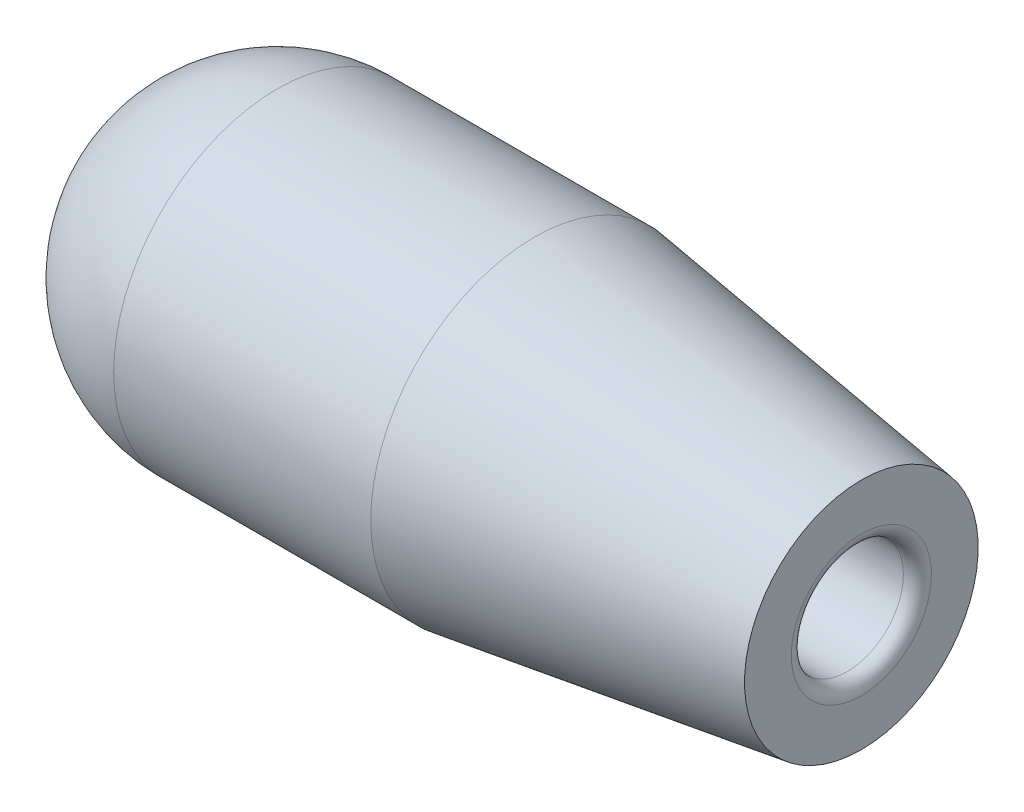
ISO-10303-21;
HEADER;
FILE_DESCRIPTION(('STEP AP214'),'2;1');
FILE_NAME('part.step','',(''),(''),'','','');
FILE_SCHEMA(('AUTOMOTIVE_DESIGN { 1 0 10303 214 1 1 1 1 }'));
ENDSEC;
DATA;
#1=APPLICATION_CONTEXT('core data for automotive mechanical design processes');
#2=APPLICATION_PROTOCOL_DEFINITION('international standard','automotive_design',2000,#1);
#3=PRODUCT_CONTEXT('',#1,'mechanical');
#4=PRODUCT('Part','Part','',(#3));
#5=PRODUCT_RELATED_PRODUCT_CATEGORY('part','',(#4));
#6=PRODUCT_DEFINITION_FORMATION('','',#4);
#7=PRODUCT_DEFINITION_CONTEXT('part definition',#1,'design');
#8=PRODUCT_DEFINITION('design','',#6,#7);
#9=PRODUCT_DEFINITION_SHAPE('','',#8);
#10=(LENGTH_UNIT() NAMED_UNIT(*) SI_UNIT(.MILLI.,.METRE.));
#11=(NAMED_UNIT(*) PLANE_ANGLE_UNIT() SI_UNIT($,.RADIAN.));
#12=(NAMED_UNIT(*) SI_UNIT($,.STERADIAN.) SOLID_ANGLE_UNIT());
#13=UNCERTAINTY_MEASURE_WITH_UNIT(LENGTH_MEASURE(1.E-05),#10,'distance_accuracy_value','');
#14=(GEOMETRIC_REPRESENTATION_CONTEXT(3) GLOBAL_UNCERTAINTY_ASSIGNED_CONTEXT((#13)) GLOBAL_UNIT_ASSIGNED_CONTEXT((#10,
#11,#12)) REPRESENTATION_CONTEXT('',''));
#15=CARTESIAN_POINT('',(0.,0.,0.));
#16=DIRECTION('',(0.,0.,1.));
#17=DIRECTION('',(1.,0.,0.));
#18=AXIS2_PLACEMENT_3D('',#15,#16,#17);
#19=CARTESIAN_POINT('',(-5.42820867057392,0.0500000154097513,0.));
#20=DIRECTION('',(-1.,0.,0.));
#21=DIRECTION('',(0.,-1.,0.));
#22=AXIS2_PLACEMENT_3D('',#19,#20,#21);
#23=CYLINDRICAL_SURFACE('',#22,1.2);
#24=CARTESIAN_POINT('',(1.27179132942606,0.0500000154097652,0.));
#25=DIRECTION('',(-1.,0.,0.));
#26=DIRECTION('',(0.,-1.,0.));
#27=AXIS2_PLACEMENT_3D('',#24,#25,#26);
#28=CIRCLE('',#27,1.2);
#29=CARTESIAN_POINT('',(1.27179132942606,-1.14999998459023,0.));
#30=VERTEX_POINT('',#29);
#31=EDGE_CURVE('E10',#30,#30,#28,.F.);
#32=ORIENTED_EDGE('',*,*,#31,.T.);
#33=EDGE_LOOP('',(#32));
#34=FACE_BOUND('',#33,.T.);
#35=CARTESIAN_POINT('',(-4.92820867057392,0.0500000154097513,0.));
#36=DIRECTION('',(-1.,0.,0.));
#37=DIRECTION('',(0.,-1.,0.));
#38=AXIS2_PLACEMENT_3D('',#35,#36,#37);
#39=CIRCLE('',#38,1.2);
#40=CARTESIAN_POINT('',(-4.92820867057392,-1.14999998459025,0.));
#41=VERTEX_POINT('',#40);
#42=EDGE_CURVE('E38',#41,#41,#39,.T.);
#43=ORIENTED_EDGE('',*,*,#42,.T.);
#44=EDGE_LOOP('',(#43));
#45=FACE_BOUND('',#44,.T.);
#46=ADVANCED_FACE('F27',(#34,#45),#23,.F.);
#47=CARTESIAN_POINT('',(-4.92820867057392,1.25000001540974,0.));
#48=DIRECTION('',(-1.,0.,0.));
#49=DIRECTION('',(0.,-1.,0.));
#50=AXIS2_PLACEMENT_3D('',#47,#48,#49);
#51=PLANE('',#50);
#52=ORIENTED_EDGE('',*,*,#42,.F.);
#53=EDGE_LOOP('',(#52));
#54=FACE_BOUND('',#53,.T.);
#55=ADVANCED_FACE('F65',(#54),#51,.F.);
#56=CARTESIAN_POINT('',(1.57179132942609,0.0500000154097513,0.));
#57=DIRECTION('',(-1.,0.,0.));
#58=DIRECTION('',(0.,-1.,0.));
#59=AXIS2_PLACEMENT_3D('',#56,#57,#58);
#60=CONICAL_SURFACE('',#59,2.5,0.141897054604164);
#61=CARTESIAN_POINT('',(-5.42820867057392,0.0500000154097513,0.));
#62=DIRECTION('',(-1.,0.,0.));
#63=DIRECTION('',(0.,-1.,0.));
#64=AXIS2_PLACEMENT_3D('',#61,#62,#63);
#65=CIRCLE('',#64,3.5);
#66=CARTESIAN_POINT('',(-5.42820867057392,-3.44999998459025,0.));
#67=VERTEX_POINT('',#66);
#68=EDGE_CURVE('E42',#67,#67,#65,.T.);
#69=ORIENTED_EDGE('',*,*,#68,.F.);
#70=EDGE_LOOP('',(#69));
#71=FACE_BOUND('',#70,.T.);
#72=CARTESIAN_POINT('',(1.57179132942609,0.0500000154097513,0.));
#73=DIRECTION('',(-1.,0.,0.));
#74=DIRECTION('',(0.,-1.,0.));
#75=AXIS2_PLACEMENT_3D('',#72,#73,#74);
#76=CIRCLE('',#75,2.5);
#77=CARTESIAN_POINT('',(1.57179132942609,-2.44999998459025,0.));
#78=VERTEX_POINT('',#77);
#79=EDGE_CURVE('E47',#78,#78,#76,.T.);
#80=ORIENTED_EDGE('',*,*,#79,.T.);
#81=EDGE_LOOP('',(#80));
#82=FACE_BOUND('',#81,.T.);
#83=ADVANCED_FACE('F62',(#71,#82),#60,.T.);
#84=CARTESIAN_POINT('',(1.57179132942609,2.55000001540974,0.));
#85=DIRECTION('',(-1.,0.,0.));
#86=DIRECTION('',(0.,-1.,0.));
#87=AXIS2_PLACEMENT_3D('',#84,#85,#86);
#88=PLANE('',#87);
#89=CARTESIAN_POINT('',(1.57179132942609,0.0500000154097513,0.));
#90=DIRECTION('',(-1.,0.,0.));
#91=DIRECTION('',(0.,-1.,0.));
#92=AXIS2_PLACEMENT_3D('',#89,#90,#91);
#93=CIRCLE('',#92,1.5);
#94=CARTESIAN_POINT('',(1.57179132942609,-1.44999998459025,0.));
#95=VERTEX_POINT('',#94);
#96=EDGE_CURVE('E34',#95,#95,#93,.T.);
#97=ORIENTED_EDGE('',*,*,#96,.T.);
#98=EDGE_LOOP('',(#97));
#99=FACE_BOUND('',#98,.T.);
#100=ORIENTED_EDGE('',*,*,#79,.F.);
#101=EDGE_LOOP('',(#100));
#102=FACE_BOUND('',#101,.T.);
#103=ADVANCED_FACE('F58',(#99,#102),#88,.F.);
#104=CARTESIAN_POINT('',(-10.9282086705739,0.0500000154097513,0.));
#105=DIRECTION('',(1.,0.,0.));
#106=DIRECTION('',(0.,1.,0.));
#107=AXIS2_PLACEMENT_3D('',#104,#105,#106);
#108=CYLINDRICAL_SURFACE('',#107,3.5);
#109=CARTESIAN_POINT('',(-10.9282086705739,0.0500000154097513,0.));
#110=DIRECTION('',(-1.,0.,0.));
#111=DIRECTION('',(0.,-1.,0.));
#112=AXIS2_PLACEMENT_3D('',#109,#110,#111);
#113=CIRCLE('',#112,3.5);
#114=CARTESIAN_POINT('',(-10.9282086705739,-3.44999998459025,0.));
#115=VERTEX_POINT('',#114);
#116=EDGE_CURVE('E50',#115,#115,#113,.T.);
#117=ORIENTED_EDGE('',*,*,#116,.F.);
#118=EDGE_LOOP('',(#117));
#119=FACE_BOUND('',#118,.T.);
#120=ORIENTED_EDGE('',*,*,#68,.T.);
#121=EDGE_LOOP('',(#120));
#122=FACE_BOUND('',#121,.T.);
#123=ADVANCED_FACE('F55',(#119,#122),#108,.T.);
#124=CARTESIAN_POINT('',(-10.9282086705739,0.0500000154097513,0.));
#125=DIRECTION('',(0.,0.,1.));
#126=DIRECTION('',(1.,0.,0.));
#127=AXIS2_PLACEMENT_3D('',#124,#125,#126);
#128=SPHERICAL_SURFACE('',#127,3.5);
#129=CARTESIAN_POINT('',(-10.9282086705739,0.0500000154097513,0.));
#130=DIRECTION('',(-1.,0.,0.));
#131=DIRECTION('',(0.,-1.,0.));
#132=AXIS2_PLACEMENT_3D('',#129,#130,#131);
#133=SPHERICAL_SURFACE('',#132,3.5);
#134=ORIENTED_EDGE('',*,*,#116,.T.);
#135=EDGE_LOOP('',(#134));
#136=FACE_BOUND('',#135,.T.);
#137=ADVANCED_FACE('F29',(#136),#133,.T.);
#138=CARTESIAN_POINT('',(1.27179132942606,0.0500000154097652,0.));
#139=DIRECTION('',(-1.,0.,0.));
#140=DIRECTION('',(0.,-1.,0.));
#141=AXIS2_PLACEMENT_3D('',#138,#139,#140);
#142=TOROIDAL_SURFACE('',#141,1.5,0.3);
#143=ORIENTED_EDGE('',*,*,#31,.F.);
#144=EDGE_LOOP('',(#143));
#145=FACE_BOUND('',#144,.T.);
#146=ORIENTED_EDGE('',*,*,#96,.F.);
#147=EDGE_LOOP('',(#146));
#148=FACE_BOUND('',#147,.T.);
#149=ADVANCED_FACE('F106',(#145,#148),#142,.T.);
#150=CLOSED_SHELL('',(#46,#55,#83,#103,#123,#137,#149));
#151=MANIFOLD_SOLID_BREP('B2',#150);
#152=ADVANCED_BREP_SHAPE_REPRESENTATION('',(#18,#151),#14);
#153=SHAPE_DEFINITION_REPRESENTATION(#9,#152);
ENDSEC;
END-ISO-10303-21;
